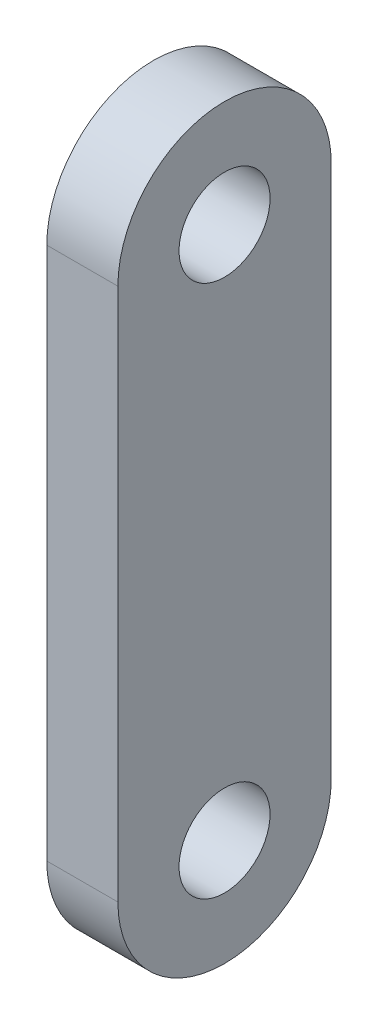
ISO-10303-21;
HEADER;
FILE_DESCRIPTION(('STEP AP214'),'2;1');
FILE_NAME('part.step','',(''),(''),'','','');
FILE_SCHEMA(('AUTOMOTIVE_DESIGN { 1 0 10303 214 1 1 1 1 }'));
ENDSEC;
DATA;
#1=APPLICATION_CONTEXT('core data for automotive mechanical design processes');
#2=APPLICATION_PROTOCOL_DEFINITION('international standard','automotive_design',2000,#1);
#3=PRODUCT_CONTEXT('',#1,'mechanical');
#4=PRODUCT('Part','Part','',(#3));
#5=PRODUCT_RELATED_PRODUCT_CATEGORY('part','',(#4));
#6=PRODUCT_DEFINITION_FORMATION('','',#4);
#7=PRODUCT_DEFINITION_CONTEXT('part definition',#1,'design');
#8=PRODUCT_DEFINITION('design','',#6,#7);
#9=PRODUCT_DEFINITION_SHAPE('','',#8);
#10=(LENGTH_UNIT() NAMED_UNIT(*) SI_UNIT(.MILLI.,.METRE.));
#11=(NAMED_UNIT(*) PLANE_ANGLE_UNIT() SI_UNIT($,.RADIAN.));
#12=(NAMED_UNIT(*) SI_UNIT($,.STERADIAN.) SOLID_ANGLE_UNIT());
#13=UNCERTAINTY_MEASURE_WITH_UNIT(LENGTH_MEASURE(1.E-05),#10,'distance_accuracy_value','');
#14=(GEOMETRIC_REPRESENTATION_CONTEXT(3) GLOBAL_UNCERTAINTY_ASSIGNED_CONTEXT((#13)) GLOBAL_UNIT_ASSIGNED_CONTEXT((#10,
#11,#12)) REPRESENTATION_CONTEXT('',''));
#15=CARTESIAN_POINT('',(0.,0.,0.));
#16=DIRECTION('',(0.,0.,1.));
#17=DIRECTION('',(1.,0.,0.));
#18=AXIS2_PLACEMENT_3D('',#15,#16,#17);
#19=CARTESIAN_POINT('',(3.175,0.,0.));
#20=DIRECTION('',(1.,0.,0.));
#21=DIRECTION('',(0.,0.,-1.));
#22=AXIS2_PLACEMENT_3D('',#19,#20,#21);
#23=PLANE('',#22);
#24=CARTESIAN_POINT('',(3.175,23.8125,0.));
#25=DIRECTION('',(1.,0.,0.));
#26=DIRECTION('',(0.,0.,-1.));
#27=AXIS2_PLACEMENT_3D('',#24,#25,#26);
#28=CIRCLE('',#27,2.032);
#29=CARTESIAN_POINT('',(3.175,23.8125,-2.032));
#30=VERTEX_POINT('',#29);
#31=EDGE_CURVE('E127',#30,#30,#28,.T.);
#32=ORIENTED_EDGE('',*,*,#31,.F.);
#33=EDGE_LOOP('',(#32));
#34=FACE_BOUND('',#33,.T.);
#35=CARTESIAN_POINT('',(3.175,0.,0.));
#36=DIRECTION('',(1.,0.,0.));
#37=DIRECTION('',(0.,0.,-1.));
#38=AXIS2_PLACEMENT_3D('',#35,#36,#37);
#39=CIRCLE('',#38,4.7625);
#40=CARTESIAN_POINT('',(3.175,0.,4.7625));
#41=VERTEX_POINT('',#40);
#42=CARTESIAN_POINT('',(3.175,0.,-4.7625));
#43=VERTEX_POINT('',#42);
#44=EDGE_CURVE('E106',#41,#43,#39,.T.);
#45=ORIENTED_EDGE('',*,*,#44,.T.);
#46=DIRECTION('',(0.,1.,0.));
#47=VECTOR('',#46,1.);
#48=CARTESIAN_POINT('',(3.175,0.,-4.7625));
#49=LINE('',#48,#47);
#50=CARTESIAN_POINT('',(3.175,23.8125,-4.7625));
#51=VERTEX_POINT('',#50);
#52=EDGE_CURVE('E100',#43,#51,#49,.T.);
#53=ORIENTED_EDGE('',*,*,#52,.T.);
#54=CARTESIAN_POINT('',(3.175,23.8125,0.));
#55=DIRECTION('',(1.,0.,0.));
#56=DIRECTION('',(0.,0.,-1.));
#57=AXIS2_PLACEMENT_3D('',#54,#55,#56);
#58=CIRCLE('',#57,4.7625);
#59=CARTESIAN_POINT('',(3.175,23.8125,4.7625));
#60=VERTEX_POINT('',#59);
#61=EDGE_CURVE('E104',#51,#60,#58,.T.);
#62=ORIENTED_EDGE('',*,*,#61,.T.);
#63=DIRECTION('',(0.,-1.,0.));
#64=VECTOR('',#63,1.);
#65=CARTESIAN_POINT('',(3.175,0.,4.7625));
#66=LINE('',#65,#64);
#67=EDGE_CURVE('E66',#60,#41,#66,.T.);
#68=ORIENTED_EDGE('',*,*,#67,.T.);
#69=EDGE_LOOP('',(#45,#53,#62,#68));
#70=FACE_BOUND('',#69,.T.);
#71=CARTESIAN_POINT('',(3.175,0.,0.));
#72=DIRECTION('',(1.,0.,0.));
#73=DIRECTION('',(0.,0.,-1.));
#74=AXIS2_PLACEMENT_3D('',#71,#72,#73);
#75=CIRCLE('',#74,2.032);
#76=CARTESIAN_POINT('',(3.175,0.,-2.032));
#77=VERTEX_POINT('',#76);
#78=EDGE_CURVE('E150',#77,#77,#75,.T.);
#79=ORIENTED_EDGE('',*,*,#78,.F.);
#80=EDGE_LOOP('',(#79));
#81=FACE_BOUND('',#80,.T.);
#82=ADVANCED_FACE('F45',(#34,#70,#81),#23,.T.);
#83=CARTESIAN_POINT('',(0.,0.,0.));
#84=DIRECTION('',(1.,0.,0.));
#85=DIRECTION('',(0.,0.,-1.));
#86=AXIS2_PLACEMENT_3D('',#83,#84,#85);
#87=PLANE('',#86);
#88=CARTESIAN_POINT('',(0.,0.,0.));
#89=DIRECTION('',(1.,0.,0.));
#90=DIRECTION('',(0.,0.,-1.));
#91=AXIS2_PLACEMENT_3D('',#88,#89,#90);
#92=CIRCLE('',#91,4.7625);
#93=CARTESIAN_POINT('',(0.,0.,4.7625));
#94=VERTEX_POINT('',#93);
#95=CARTESIAN_POINT('',(0.,0.,-4.7625));
#96=VERTEX_POINT('',#95);
#97=EDGE_CURVE('E123',#94,#96,#92,.T.);
#98=ORIENTED_EDGE('',*,*,#97,.F.);
#99=DIRECTION('',(0.,-1.,0.));
#100=VECTOR('',#99,1.);
#101=CARTESIAN_POINT('',(0.,0.,4.7625));
#102=LINE('',#101,#100);
#103=CARTESIAN_POINT('',(0.,23.8125,4.7625));
#104=VERTEX_POINT('',#103);
#105=EDGE_CURVE('E93',#104,#94,#102,.T.);
#106=ORIENTED_EDGE('',*,*,#105,.F.);
#107=CARTESIAN_POINT('',(0.,23.8125,0.));
#108=DIRECTION('',(1.,0.,0.));
#109=DIRECTION('',(0.,0.,-1.));
#110=AXIS2_PLACEMENT_3D('',#107,#108,#109);
#111=CIRCLE('',#110,4.7625);
#112=CARTESIAN_POINT('',(0.,23.8125,-4.7625));
#113=VERTEX_POINT('',#112);
#114=EDGE_CURVE('E87',#113,#104,#111,.T.);
#115=ORIENTED_EDGE('',*,*,#114,.F.);
#116=DIRECTION('',(0.,1.,0.));
#117=VECTOR('',#116,1.);
#118=CARTESIAN_POINT('',(0.,0.,-4.7625));
#119=LINE('',#118,#117);
#120=EDGE_CURVE('E111',#96,#113,#119,.T.);
#121=ORIENTED_EDGE('',*,*,#120,.F.);
#122=EDGE_LOOP('',(#98,#106,#115,#121));
#123=FACE_BOUND('',#122,.T.);
#124=CARTESIAN_POINT('',(0.,23.8125,0.));
#125=DIRECTION('',(1.,0.,0.));
#126=DIRECTION('',(0.,0.,-1.));
#127=AXIS2_PLACEMENT_3D('',#124,#125,#126);
#128=CIRCLE('',#127,2.032);
#129=CARTESIAN_POINT('',(0.,23.8125,-2.032));
#130=VERTEX_POINT('',#129);
#131=EDGE_CURVE('E146',#130,#130,#128,.T.);
#132=ORIENTED_EDGE('',*,*,#131,.T.);
#133=EDGE_LOOP('',(#132));
#134=FACE_BOUND('',#133,.T.);
#135=CARTESIAN_POINT('',(0.,0.,0.));
#136=DIRECTION('',(1.,0.,0.));
#137=DIRECTION('',(0.,0.,-1.));
#138=AXIS2_PLACEMENT_3D('',#135,#136,#137);
#139=CIRCLE('',#138,2.032);
#140=CARTESIAN_POINT('',(0.,0.,-2.032));
#141=VERTEX_POINT('',#140);
#142=EDGE_CURVE('E153',#141,#141,#139,.T.);
#143=ORIENTED_EDGE('',*,*,#142,.T.);
#144=EDGE_LOOP('',(#143));
#145=FACE_BOUND('',#144,.T.);
#146=ADVANCED_FACE('F141',(#123,#134,#145),#87,.F.);
#147=CARTESIAN_POINT('',(3.175,0.,0.));
#148=DIRECTION('',(-1.,0.,0.));
#149=DIRECTION('',(0.,0.,1.));
#150=AXIS2_PLACEMENT_3D('',#147,#148,#149);
#151=CYLINDRICAL_SURFACE('',#150,4.7625);
#152=ORIENTED_EDGE('',*,*,#97,.T.);
#153=DIRECTION('',(-1.,0.,0.));
#154=VECTOR('',#153,1.);
#155=CARTESIAN_POINT('',(3.175,0.,-4.7625));
#156=LINE('',#155,#154);
#157=EDGE_CURVE('E11',#43,#96,#156,.T.);
#158=ORIENTED_EDGE('',*,*,#157,.F.);
#159=ORIENTED_EDGE('',*,*,#44,.F.);
#160=DIRECTION('',(-1.,0.,0.));
#161=VECTOR('',#160,1.);
#162=CARTESIAN_POINT('',(3.175,0.,4.7625));
#163=LINE('',#162,#161);
#164=EDGE_CURVE('E119',#41,#94,#163,.T.);
#165=ORIENTED_EDGE('',*,*,#164,.T.);
#166=EDGE_LOOP('',(#152,#158,#159,#165));
#167=FACE_BOUND('',#166,.T.);
#168=ADVANCED_FACE('F47',(#167),#151,.T.);
#169=CARTESIAN_POINT('',(3.175,0.,-4.7625));
#170=DIRECTION('',(0.,0.,1.));
#171=DIRECTION('',(1.,0.,0.));
#172=AXIS2_PLACEMENT_3D('',#169,#170,#171);
#173=PLANE('',#172);
#174=ORIENTED_EDGE('',*,*,#120,.T.);
#175=DIRECTION('',(-1.,0.,0.));
#176=VECTOR('',#175,1.);
#177=CARTESIAN_POINT('',(3.175,23.8125,-4.7625));
#178=LINE('',#177,#176);
#179=EDGE_CURVE('E55',#51,#113,#178,.T.);
#180=ORIENTED_EDGE('',*,*,#179,.F.);
#181=ORIENTED_EDGE('',*,*,#52,.F.);
#182=ORIENTED_EDGE('',*,*,#157,.T.);
#183=EDGE_LOOP('',(#174,#180,#181,#182));
#184=FACE_BOUND('',#183,.T.);
#185=ADVANCED_FACE('F110',(#184),#173,.F.);
#186=CARTESIAN_POINT('',(3.175,23.8125,0.));
#187=DIRECTION('',(-1.,0.,0.));
#188=DIRECTION('',(0.,0.,1.));
#189=AXIS2_PLACEMENT_3D('',#186,#187,#188);
#190=CYLINDRICAL_SURFACE('',#189,4.7625);
#191=ORIENTED_EDGE('',*,*,#114,.T.);
#192=DIRECTION('',(-1.,0.,0.));
#193=VECTOR('',#192,1.);
#194=CARTESIAN_POINT('',(3.175,23.8125,4.7625));
#195=LINE('',#194,#193);
#196=EDGE_CURVE('E113',#60,#104,#195,.T.);
#197=ORIENTED_EDGE('',*,*,#196,.F.);
#198=ORIENTED_EDGE('',*,*,#61,.F.);
#199=ORIENTED_EDGE('',*,*,#179,.T.);
#200=EDGE_LOOP('',(#191,#197,#198,#199));
#201=FACE_BOUND('',#200,.T.);
#202=ADVANCED_FACE('F114',(#201),#190,.T.);
#203=CARTESIAN_POINT('',(3.175,0.,4.7625));
#204=DIRECTION('',(0.,0.,-1.));
#205=DIRECTION('',(-1.,0.,0.));
#206=AXIS2_PLACEMENT_3D('',#203,#204,#205);
#207=PLANE('',#206);
#208=ORIENTED_EDGE('',*,*,#105,.T.);
#209=ORIENTED_EDGE('',*,*,#164,.F.);
#210=ORIENTED_EDGE('',*,*,#67,.F.);
#211=ORIENTED_EDGE('',*,*,#196,.T.);
#212=EDGE_LOOP('',(#208,#209,#210,#211));
#213=FACE_BOUND('',#212,.T.);
#214=ADVANCED_FACE('F138',(#213),#207,.F.);
#215=CARTESIAN_POINT('',(3.175,23.8125,0.));
#216=DIRECTION('',(-1.,0.,0.));
#217=DIRECTION('',(0.,0.,1.));
#218=AXIS2_PLACEMENT_3D('',#215,#216,#217);
#219=CYLINDRICAL_SURFACE('',#218,2.032);
#220=ORIENTED_EDGE('',*,*,#31,.T.);
#221=EDGE_LOOP('',(#220));
#222=FACE_BOUND('',#221,.T.);
#223=ORIENTED_EDGE('',*,*,#131,.F.);
#224=EDGE_LOOP('',(#223));
#225=FACE_BOUND('',#224,.T.);
#226=ADVANCED_FACE('F170',(#222,#225),#219,.F.);
#227=CARTESIAN_POINT('',(3.175,0.,0.));
#228=DIRECTION('',(-1.,0.,0.));
#229=DIRECTION('',(0.,0.,1.));
#230=AXIS2_PLACEMENT_3D('',#227,#228,#229);
#231=CYLINDRICAL_SURFACE('',#230,2.032);
#232=ORIENTED_EDGE('',*,*,#78,.T.);
#233=EDGE_LOOP('',(#232));
#234=FACE_BOUND('',#233,.T.);
#235=ORIENTED_EDGE('',*,*,#142,.F.);
#236=EDGE_LOOP('',(#235));
#237=FACE_BOUND('',#236,.T.);
#238=ADVANCED_FACE('F160',(#234,#237),#231,.F.);
#239=CLOSED_SHELL('',(#82,#146,#168,#185,#202,#214,#226,#238));
#240=MANIFOLD_SOLID_BREP('B2',#239);
#241=ADVANCED_BREP_SHAPE_REPRESENTATION('',(#18,#240),#14);
#242=SHAPE_DEFINITION_REPRESENTATION(#9,#241);
ENDSEC;
END-ISO-10303-21;
